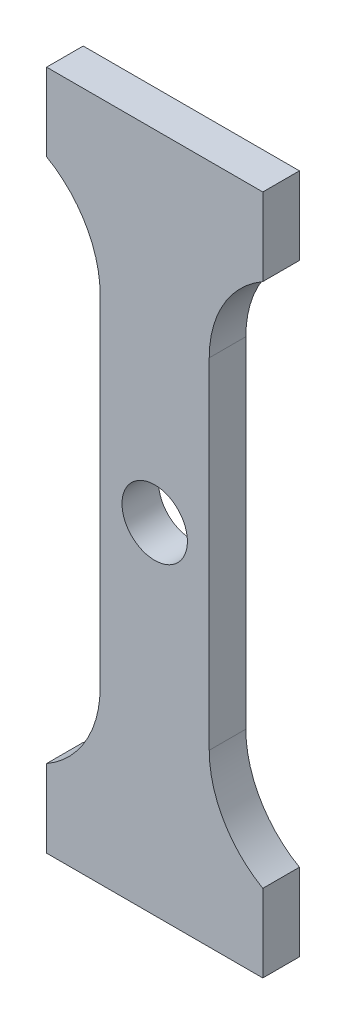
ISO-10303-21;
HEADER;
FILE_DESCRIPTION(('STEP AP214'),'2;1');
FILE_NAME('part.step','',(''),(''),'','','');
FILE_SCHEMA(('AUTOMOTIVE_DESIGN { 1 0 10303 214 1 1 1 1 }'));
ENDSEC;
DATA;
#1=APPLICATION_CONTEXT('core data for automotive mechanical design processes');
#2=APPLICATION_PROTOCOL_DEFINITION('international standard','automotive_design',2000,#1);
#3=PRODUCT_CONTEXT('',#1,'mechanical');
#4=PRODUCT('Part','Part','',(#3));
#5=PRODUCT_RELATED_PRODUCT_CATEGORY('part','',(#4));
#6=PRODUCT_DEFINITION_FORMATION('','',#4);
#7=PRODUCT_DEFINITION_CONTEXT('part definition',#1,'design');
#8=PRODUCT_DEFINITION('design','',#6,#7);
#9=PRODUCT_DEFINITION_SHAPE('','',#8);
#10=(LENGTH_UNIT() NAMED_UNIT(*) SI_UNIT(.MILLI.,.METRE.));
#11=(NAMED_UNIT(*) PLANE_ANGLE_UNIT() SI_UNIT($,.RADIAN.));
#12=(NAMED_UNIT(*) SI_UNIT($,.STERADIAN.) SOLID_ANGLE_UNIT());
#13=UNCERTAINTY_MEASURE_WITH_UNIT(LENGTH_MEASURE(1.E-05),#10,'distance_accuracy_value','');
#14=(GEOMETRIC_REPRESENTATION_CONTEXT(3) GLOBAL_UNCERTAINTY_ASSIGNED_CONTEXT((#13)) GLOBAL_UNIT_ASSIGNED_CONTEXT((#10,
#11,#12)) REPRESENTATION_CONTEXT('',''));
#15=CARTESIAN_POINT('',(0.,0.,0.));
#16=DIRECTION('',(0.,0.,1.));
#17=DIRECTION('',(1.,0.,0.));
#18=AXIS2_PLACEMENT_3D('',#15,#16,#17);
#19=CARTESIAN_POINT('',(-44.1666236676775,46.4188626587832,10.));
#20=DIRECTION('',(0.,0.,1.));
#21=DIRECTION('',(1.,0.,0.));
#22=AXIS2_PLACEMENT_3D('',#19,#20,#21);
#23=PLANE('',#22);
#24=DIRECTION('',(0.,-1.,0.));
#25=VECTOR('',#24,1.);
#26=CARTESIAN_POINT('',(-29.5271848431229,92.9707306546977,10.));
#27=LINE('',#26,#25);
#28=CARTESIAN_POINT('',(-29.5271848431229,92.9707306546977,10.));
#29=VERTEX_POINT('',#28);
#30=CARTESIAN_POINT('',(-29.5271848431229,71.764892872897,10.));
#31=VERTEX_POINT('',#30);
#32=EDGE_CURVE('E183',#29,#31,#27,.T.);
#33=ORIENTED_EDGE('',*,*,#32,.T.);
#34=CARTESIAN_POINT('',(-44.1666236676775,46.4188626587832,10.));
#35=DIRECTION('',(0.,0.,-1.));
#36=DIRECTION('',(1.,0.,0.));
#37=AXIS2_PLACEMENT_3D('',#34,#35,#36);
#38=CIRCLE('',#37,29.2700259089849);
#39=CARTESIAN_POINT('',(-14.8965977586926,46.4188626587833,10.));
#40=VERTEX_POINT('',#39);
#41=EDGE_CURVE('E111',#31,#40,#38,.T.);
#42=ORIENTED_EDGE('',*,*,#41,.T.);
#43=DIRECTION('',(0.,-1.,0.));
#44=VECTOR('',#43,1.);
#45=CARTESIAN_POINT('',(-14.8965977586926,46.4188626587833,10.));
#46=LINE('',#45,#44);
#47=CARTESIAN_POINT('',(-14.8965977586926,-46.4188626587832,10.));
#48=VERTEX_POINT('',#47);
#49=EDGE_CURVE('E210',#40,#48,#46,.T.);
#50=ORIENTED_EDGE('',*,*,#49,.T.);
#51=CARTESIAN_POINT('',(-44.1666236676775,-46.4188626587832,10.));
#52=DIRECTION('',(0.,0.,-1.));
#53=DIRECTION('',(-1.,0.,0.));
#54=AXIS2_PLACEMENT_3D('',#51,#52,#53);
#55=CIRCLE('',#54,29.2700259089849);
#56=CARTESIAN_POINT('',(-29.5271848431229,-71.764892872897,10.));
#57=VERTEX_POINT('',#56);
#58=EDGE_CURVE('E229',#48,#57,#55,.T.);
#59=ORIENTED_EDGE('',*,*,#58,.T.);
#60=DIRECTION('',(0.,-1.,0.));
#61=VECTOR('',#60,1.);
#62=CARTESIAN_POINT('',(-29.5271848431229,-92.9707306546977,10.));
#63=LINE('',#62,#61);
#64=CARTESIAN_POINT('',(-29.5271848431229,-92.9707306546977,10.));
#65=VERTEX_POINT('',#64);
#66=EDGE_CURVE('E226',#57,#65,#63,.T.);
#67=ORIENTED_EDGE('',*,*,#66,.T.);
#68=DIRECTION('',(1.,0.,0.));
#69=VECTOR('',#68,1.);
#70=CARTESIAN_POINT('',(29.5271848431229,-92.9707306546977,10.));
#71=LINE('',#70,#69);
#72=CARTESIAN_POINT('',(29.5271848431229,-92.9707306546977,10.));
#73=VERTEX_POINT('',#72);
#74=EDGE_CURVE('E228',#65,#73,#71,.T.);
#75=ORIENTED_EDGE('',*,*,#74,.T.);
#76=DIRECTION('',(0.,1.,0.));
#77=VECTOR('',#76,1.);
#78=CARTESIAN_POINT('',(29.5271848431229,-92.9707306546977,10.));
#79=LINE('',#78,#77);
#80=CARTESIAN_POINT('',(29.5271848431229,-71.764892872897,10.));
#81=VERTEX_POINT('',#80);
#82=EDGE_CURVE('E231',#73,#81,#79,.T.);
#83=ORIENTED_EDGE('',*,*,#82,.T.);
#84=CARTESIAN_POINT('',(44.1666236676775,-46.4188626587832,10.));
#85=DIRECTION('',(0.,0.,-1.));
#86=DIRECTION('',(1.,0.,0.));
#87=AXIS2_PLACEMENT_3D('',#84,#85,#86);
#88=CIRCLE('',#87,29.2700259089849);
#89=CARTESIAN_POINT('',(14.8965977586926,-46.4188626587833,10.));
#90=VERTEX_POINT('',#89);
#91=EDGE_CURVE('E237',#81,#90,#88,.T.);
#92=ORIENTED_EDGE('',*,*,#91,.T.);
#93=DIRECTION('',(0.,1.,0.));
#94=VECTOR('',#93,1.);
#95=CARTESIAN_POINT('',(14.8965977586926,46.4188626587833,10.));
#96=LINE('',#95,#94);
#97=CARTESIAN_POINT('',(14.8965977586926,46.4188626587833,10.));
#98=VERTEX_POINT('',#97);
#99=EDGE_CURVE('E142',#90,#98,#96,.T.);
#100=ORIENTED_EDGE('',*,*,#99,.T.);
#101=CARTESIAN_POINT('',(44.1666236676775,46.4188626587832,10.));
#102=DIRECTION('',(0.,0.,-1.));
#103=DIRECTION('',(-1.,0.,0.));
#104=AXIS2_PLACEMENT_3D('',#101,#102,#103);
#105=CIRCLE('',#104,29.2700259089849);
#106=CARTESIAN_POINT('',(29.5271848431229,71.764892872897,10.));
#107=VERTEX_POINT('',#106);
#108=EDGE_CURVE('E136',#98,#107,#105,.T.);
#109=ORIENTED_EDGE('',*,*,#108,.T.);
#110=DIRECTION('',(0.,1.,0.));
#111=VECTOR('',#110,1.);
#112=CARTESIAN_POINT('',(29.5271848431229,92.9707306546977,10.));
#113=LINE('',#112,#111);
#114=CARTESIAN_POINT('',(29.5271848431229,92.9707306546977,10.));
#115=VERTEX_POINT('',#114);
#116=EDGE_CURVE('E140',#107,#115,#113,.T.);
#117=ORIENTED_EDGE('',*,*,#116,.T.);
#118=DIRECTION('',(-1.,0.,0.));
#119=VECTOR('',#118,1.);
#120=CARTESIAN_POINT('',(29.5271848431229,92.9707306546977,10.));
#121=LINE('',#120,#119);
#122=EDGE_CURVE('E56',#115,#29,#121,.T.);
#123=ORIENTED_EDGE('',*,*,#122,.T.);
#124=EDGE_LOOP('',(#33,#42,#50,#59,#67,#75,#83,#92,#100,#109,#117,#123));
#125=FACE_BOUND('',#124,.T.);
#126=CARTESIAN_POINT('',(0.,0.,10.));
#127=DIRECTION('',(0.,0.,1.));
#128=DIRECTION('',(1.,0.,0.));
#129=AXIS2_PLACEMENT_3D('',#126,#127,#128);
#130=CIRCLE('',#129,8.93910654423591);
#131=CARTESIAN_POINT('',(8.93910654423591,0.,10.));
#132=VERTEX_POINT('',#131);
#133=EDGE_CURVE('E164',#132,#132,#130,.T.);
#134=ORIENTED_EDGE('',*,*,#133,.F.);
#135=EDGE_LOOP('',(#134));
#136=FACE_BOUND('',#135,.T.);
#137=ADVANCED_FACE('F39',(#125,#136),#23,.T.);
#138=CARTESIAN_POINT('',(-44.1666236676775,46.4188626587832,0.));
#139=DIRECTION('',(0.,0.,1.));
#140=DIRECTION('',(1.,0.,0.));
#141=AXIS2_PLACEMENT_3D('',#138,#139,#140);
#142=PLANE('',#141);
#143=DIRECTION('',(0.,-1.,0.));
#144=VECTOR('',#143,1.);
#145=CARTESIAN_POINT('',(-29.5271848431229,92.9707306546977,0.));
#146=LINE('',#145,#144);
#147=CARTESIAN_POINT('',(-29.5271848431229,92.9707306546977,0.));
#148=VERTEX_POINT('',#147);
#149=CARTESIAN_POINT('',(-29.5271848431229,71.764892872897,0.));
#150=VERTEX_POINT('',#149);
#151=EDGE_CURVE('E160',#148,#150,#146,.T.);
#152=ORIENTED_EDGE('',*,*,#151,.F.);
#153=DIRECTION('',(-1.,0.,0.));
#154=VECTOR('',#153,1.);
#155=CARTESIAN_POINT('',(29.5271848431229,92.9707306546977,0.));
#156=LINE('',#155,#154);
#157=CARTESIAN_POINT('',(29.5271848431229,92.9707306546977,0.));
#158=VERTEX_POINT('',#157);
#159=EDGE_CURVE('E103',#158,#148,#156,.T.);
#160=ORIENTED_EDGE('',*,*,#159,.F.);
#161=DIRECTION('',(0.,1.,0.));
#162=VECTOR('',#161,1.);
#163=CARTESIAN_POINT('',(29.5271848431229,92.9707306546977,0.));
#164=LINE('',#163,#162);
#165=CARTESIAN_POINT('',(29.5271848431229,71.764892872897,0.));
#166=VERTEX_POINT('',#165);
#167=EDGE_CURVE('E97',#166,#158,#164,.T.);
#168=ORIENTED_EDGE('',*,*,#167,.F.);
#169=CARTESIAN_POINT('',(44.1666236676775,46.4188626587832,0.));
#170=DIRECTION('',(0.,0.,-1.));
#171=DIRECTION('',(-1.,0.,0.));
#172=AXIS2_PLACEMENT_3D('',#169,#170,#171);
#173=CIRCLE('',#172,29.2700259089849);
#174=CARTESIAN_POINT('',(14.8965977586926,46.4188626587833,0.));
#175=VERTEX_POINT('',#174);
#176=EDGE_CURVE('E150',#175,#166,#173,.T.);
#177=ORIENTED_EDGE('',*,*,#176,.F.);
#178=DIRECTION('',(0.,1.,0.));
#179=VECTOR('',#178,1.);
#180=CARTESIAN_POINT('',(14.8965977586926,46.4188626587833,0.));
#181=LINE('',#180,#179);
#182=CARTESIAN_POINT('',(14.8965977586926,-46.4188626587833,0.));
#183=VERTEX_POINT('',#182);
#184=EDGE_CURVE('E178',#183,#175,#181,.T.);
#185=ORIENTED_EDGE('',*,*,#184,.F.);
#186=CARTESIAN_POINT('',(44.1666236676775,-46.4188626587832,0.));
#187=DIRECTION('',(0.,0.,-1.));
#188=DIRECTION('',(1.,0.,0.));
#189=AXIS2_PLACEMENT_3D('',#186,#187,#188);
#190=CIRCLE('',#189,29.2700259089849);
#191=CARTESIAN_POINT('',(29.5271848431229,-71.764892872897,0.));
#192=VERTEX_POINT('',#191);
#193=EDGE_CURVE('E176',#192,#183,#190,.T.);
#194=ORIENTED_EDGE('',*,*,#193,.F.);
#195=DIRECTION('',(0.,1.,0.));
#196=VECTOR('',#195,1.);
#197=CARTESIAN_POINT('',(29.5271848431229,-92.9707306546977,0.));
#198=LINE('',#197,#196);
#199=CARTESIAN_POINT('',(29.5271848431229,-92.9707306546977,0.));
#200=VERTEX_POINT('',#199);
#201=EDGE_CURVE('E174',#200,#192,#198,.T.);
#202=ORIENTED_EDGE('',*,*,#201,.F.);
#203=DIRECTION('',(1.,0.,0.));
#204=VECTOR('',#203,1.);
#205=CARTESIAN_POINT('',(29.5271848431229,-92.9707306546977,0.));
#206=LINE('',#205,#204);
#207=CARTESIAN_POINT('',(-29.5271848431229,-92.9707306546977,0.));
#208=VERTEX_POINT('',#207);
#209=EDGE_CURVE('E172',#208,#200,#206,.T.);
#210=ORIENTED_EDGE('',*,*,#209,.F.);
#211=DIRECTION('',(0.,-1.,0.));
#212=VECTOR('',#211,1.);
#213=CARTESIAN_POINT('',(-29.5271848431229,-92.9707306546977,0.));
#214=LINE('',#213,#212);
#215=CARTESIAN_POINT('',(-29.5271848431229,-71.764892872897,0.));
#216=VERTEX_POINT('',#215);
#217=EDGE_CURVE('E170',#216,#208,#214,.T.);
#218=ORIENTED_EDGE('',*,*,#217,.F.);
#219=CARTESIAN_POINT('',(-44.1666236676775,-46.4188626587832,0.));
#220=DIRECTION('',(0.,0.,-1.));
#221=DIRECTION('',(-1.,0.,0.));
#222=AXIS2_PLACEMENT_3D('',#219,#220,#221);
#223=CIRCLE('',#222,29.2700259089849);
#224=CARTESIAN_POINT('',(-14.8965977586926,-46.4188626587832,0.));
#225=VERTEX_POINT('',#224);
#226=EDGE_CURVE('E168',#225,#216,#223,.T.);
#227=ORIENTED_EDGE('',*,*,#226,.F.);
#228=DIRECTION('',(0.,-1.,0.));
#229=VECTOR('',#228,1.);
#230=CARTESIAN_POINT('',(-14.8965977586926,46.4188626587833,0.));
#231=LINE('',#230,#229);
#232=CARTESIAN_POINT('',(-14.8965977586926,46.4188626587833,0.));
#233=VERTEX_POINT('',#232);
#234=EDGE_CURVE('E166',#233,#225,#231,.T.);
#235=ORIENTED_EDGE('',*,*,#234,.F.);
#236=CARTESIAN_POINT('',(-44.1666236676775,46.4188626587832,0.));
#237=DIRECTION('',(0.,0.,-1.));
#238=DIRECTION('',(1.,0.,0.));
#239=AXIS2_PLACEMENT_3D('',#236,#237,#238);
#240=CIRCLE('',#239,29.2700259089849);
#241=EDGE_CURVE('E163',#150,#233,#240,.T.);
#242=ORIENTED_EDGE('',*,*,#241,.F.);
#243=EDGE_LOOP('',(#152,#160,#168,#177,#185,#194,#202,#210,#218,#227,#235,#242));
#244=FACE_BOUND('',#243,.T.);
#245=CARTESIAN_POINT('',(0.,0.,0.));
#246=DIRECTION('',(0.,0.,1.));
#247=DIRECTION('',(1.,0.,0.));
#248=AXIS2_PLACEMENT_3D('',#245,#246,#247);
#249=CIRCLE('',#248,8.93910654423591);
#250=CARTESIAN_POINT('',(8.93910654423591,0.,0.));
#251=VERTEX_POINT('',#250);
#252=EDGE_CURVE('E388',#251,#251,#249,.T.);
#253=ORIENTED_EDGE('',*,*,#252,.T.);
#254=EDGE_LOOP('',(#253));
#255=FACE_BOUND('',#254,.T.);
#256=ADVANCED_FACE('F214',(#244,#255),#142,.F.);
#257=CARTESIAN_POINT('',(-29.5271848431229,92.9707306546977,10.));
#258=DIRECTION('',(1.,0.,0.));
#259=DIRECTION('',(0.,0.,-1.));
#260=AXIS2_PLACEMENT_3D('',#257,#258,#259);
#261=PLANE('',#260);
#262=ORIENTED_EDGE('',*,*,#151,.T.);
#263=DIRECTION('',(0.,0.,-1.));
#264=VECTOR('',#263,1.);
#265=CARTESIAN_POINT('',(-29.5271848431229,71.764892872897,10.));
#266=LINE('',#265,#264);
#267=EDGE_CURVE('E11',#31,#150,#266,.T.);
#268=ORIENTED_EDGE('',*,*,#267,.F.);
#269=ORIENTED_EDGE('',*,*,#32,.F.);
#270=DIRECTION('',(0.,0.,-1.));
#271=VECTOR('',#270,1.);
#272=CARTESIAN_POINT('',(-29.5271848431229,92.9707306546977,10.));
#273=LINE('',#272,#271);
#274=EDGE_CURVE('E156',#29,#148,#273,.T.);
#275=ORIENTED_EDGE('',*,*,#274,.T.);
#276=EDGE_LOOP('',(#262,#268,#269,#275));
#277=FACE_BOUND('',#276,.T.);
#278=ADVANCED_FACE('F41',(#277),#261,.F.);
#279=CARTESIAN_POINT('',(-44.1666236676775,46.4188626587832,10.));
#280=DIRECTION('',(0.,0.,-1.));
#281=DIRECTION('',(-1.,0.,0.));
#282=AXIS2_PLACEMENT_3D('',#279,#280,#281);
#283=CYLINDRICAL_SURFACE('',#282,29.2700259089849);
#284=ORIENTED_EDGE('',*,*,#241,.T.);
#285=DIRECTION('',(0.,0.,-1.));
#286=VECTOR('',#285,1.);
#287=CARTESIAN_POINT('',(-14.8965977586926,46.4188626587833,10.));
#288=LINE('',#287,#286);
#289=EDGE_CURVE('E48',#40,#233,#288,.T.);
#290=ORIENTED_EDGE('',*,*,#289,.F.);
#291=ORIENTED_EDGE('',*,*,#41,.F.);
#292=ORIENTED_EDGE('',*,*,#267,.T.);
#293=EDGE_LOOP('',(#284,#290,#291,#292));
#294=FACE_BOUND('',#293,.T.);
#295=ADVANCED_FACE('F271',(#294),#283,.F.);
#296=CARTESIAN_POINT('',(-14.8965977586926,46.4188626587833,10.));
#297=DIRECTION('',(1.,0.,0.));
#298=DIRECTION('',(0.,0.,-1.));
#299=AXIS2_PLACEMENT_3D('',#296,#297,#298);
#300=PLANE('',#299);
#301=ORIENTED_EDGE('',*,*,#234,.T.);
#302=DIRECTION('',(0.,0.,-1.));
#303=VECTOR('',#302,1.);
#304=CARTESIAN_POINT('',(-14.8965977586926,-46.4188626587832,10.));
#305=LINE('',#304,#303);
#306=EDGE_CURVE('E202',#48,#225,#305,.T.);
#307=ORIENTED_EDGE('',*,*,#306,.F.);
#308=ORIENTED_EDGE('',*,*,#49,.F.);
#309=ORIENTED_EDGE('',*,*,#289,.T.);
#310=EDGE_LOOP('',(#301,#307,#308,#309));
#311=FACE_BOUND('',#310,.T.);
#312=ADVANCED_FACE('F208',(#311),#300,.F.);
#313=CARTESIAN_POINT('',(-44.1666236676775,-46.4188626587832,10.));
#314=DIRECTION('',(0.,0.,-1.));
#315=DIRECTION('',(-1.,0.,0.));
#316=AXIS2_PLACEMENT_3D('',#313,#314,#315);
#317=CYLINDRICAL_SURFACE('',#316,29.2700259089849);
#318=ORIENTED_EDGE('',*,*,#226,.T.);
#319=DIRECTION('',(0.,0.,-1.));
#320=VECTOR('',#319,1.);
#321=CARTESIAN_POINT('',(-29.5271848431229,-71.764892872897,10.));
#322=LINE('',#321,#320);
#323=EDGE_CURVE('E199',#57,#216,#322,.T.);
#324=ORIENTED_EDGE('',*,*,#323,.F.);
#325=ORIENTED_EDGE('',*,*,#58,.F.);
#326=ORIENTED_EDGE('',*,*,#306,.T.);
#327=EDGE_LOOP('',(#318,#324,#325,#326));
#328=FACE_BOUND('',#327,.T.);
#329=ADVANCED_FACE('F220',(#328),#317,.F.);
#330=CARTESIAN_POINT('',(-29.5271848431229,-92.9707306546977,10.));
#331=DIRECTION('',(1.,0.,0.));
#332=DIRECTION('',(0.,0.,-1.));
#333=AXIS2_PLACEMENT_3D('',#330,#331,#332);
#334=PLANE('',#333);
#335=ORIENTED_EDGE('',*,*,#217,.T.);
#336=DIRECTION('',(0.,0.,-1.));
#337=VECTOR('',#336,1.);
#338=CARTESIAN_POINT('',(-29.5271848431229,-92.9707306546977,10.));
#339=LINE('',#338,#337);
#340=EDGE_CURVE('E196',#65,#208,#339,.T.);
#341=ORIENTED_EDGE('',*,*,#340,.F.);
#342=ORIENTED_EDGE('',*,*,#66,.F.);
#343=ORIENTED_EDGE('',*,*,#323,.T.);
#344=EDGE_LOOP('',(#335,#341,#342,#343));
#345=FACE_BOUND('',#344,.T.);
#346=ADVANCED_FACE('F224',(#345),#334,.F.);
#347=CARTESIAN_POINT('',(29.5271848431229,-92.9707306546977,10.));
#348=DIRECTION('',(0.,1.,0.));
#349=DIRECTION('',(0.,0.,1.));
#350=AXIS2_PLACEMENT_3D('',#347,#348,#349);
#351=PLANE('',#350);
#352=ORIENTED_EDGE('',*,*,#209,.T.);
#353=DIRECTION('',(0.,0.,-1.));
#354=VECTOR('',#353,1.);
#355=CARTESIAN_POINT('',(29.5271848431229,-92.9707306546977,10.));
#356=LINE('',#355,#354);
#357=EDGE_CURVE('E193',#73,#200,#356,.T.);
#358=ORIENTED_EDGE('',*,*,#357,.F.);
#359=ORIENTED_EDGE('',*,*,#74,.F.);
#360=ORIENTED_EDGE('',*,*,#340,.T.);
#361=EDGE_LOOP('',(#352,#358,#359,#360));
#362=FACE_BOUND('',#361,.T.);
#363=ADVANCED_FACE('F284',(#362),#351,.F.);
#364=CARTESIAN_POINT('',(29.5271848431229,-92.9707306546977,10.));
#365=DIRECTION('',(-1.,0.,0.));
#366=DIRECTION('',(0.,0.,1.));
#367=AXIS2_PLACEMENT_3D('',#364,#365,#366);
#368=PLANE('',#367);
#369=ORIENTED_EDGE('',*,*,#201,.T.);
#370=DIRECTION('',(0.,0.,-1.));
#371=VECTOR('',#370,1.);
#372=CARTESIAN_POINT('',(29.5271848431229,-71.764892872897,10.));
#373=LINE('',#372,#371);
#374=EDGE_CURVE('E190',#81,#192,#373,.T.);
#375=ORIENTED_EDGE('',*,*,#374,.F.);
#376=ORIENTED_EDGE('',*,*,#82,.F.);
#377=ORIENTED_EDGE('',*,*,#357,.T.);
#378=EDGE_LOOP('',(#369,#375,#376,#377));
#379=FACE_BOUND('',#378,.T.);
#380=ADVANCED_FACE('F287',(#379),#368,.F.);
#381=CARTESIAN_POINT('',(44.1666236676775,-46.4188626587832,10.));
#382=DIRECTION('',(0.,0.,-1.));
#383=DIRECTION('',(-1.,0.,0.));
#384=AXIS2_PLACEMENT_3D('',#381,#382,#383);
#385=CYLINDRICAL_SURFACE('',#384,29.2700259089849);
#386=ORIENTED_EDGE('',*,*,#193,.T.);
#387=DIRECTION('',(0.,0.,-1.));
#388=VECTOR('',#387,1.);
#389=CARTESIAN_POINT('',(14.8965977586926,-46.4188626587833,10.));
#390=LINE('',#389,#388);
#391=EDGE_CURVE('E187',#90,#183,#390,.T.);
#392=ORIENTED_EDGE('',*,*,#391,.F.);
#393=ORIENTED_EDGE('',*,*,#91,.F.);
#394=ORIENTED_EDGE('',*,*,#374,.T.);
#395=EDGE_LOOP('',(#386,#392,#393,#394));
#396=FACE_BOUND('',#395,.T.);
#397=ADVANCED_FACE('F243',(#396),#385,.F.);
#398=CARTESIAN_POINT('',(14.8965977586926,46.4188626587833,10.));
#399=DIRECTION('',(-1.,0.,0.));
#400=DIRECTION('',(0.,0.,1.));
#401=AXIS2_PLACEMENT_3D('',#398,#399,#400);
#402=PLANE('',#401);
#403=ORIENTED_EDGE('',*,*,#184,.T.);
#404=DIRECTION('',(0.,0.,-1.));
#405=VECTOR('',#404,1.);
#406=CARTESIAN_POINT('',(14.8965977586926,46.4188626587833,10.));
#407=LINE('',#406,#405);
#408=EDGE_CURVE('E151',#98,#175,#407,.T.);
#409=ORIENTED_EDGE('',*,*,#408,.F.);
#410=ORIENTED_EDGE('',*,*,#99,.F.);
#411=ORIENTED_EDGE('',*,*,#391,.T.);
#412=EDGE_LOOP('',(#403,#409,#410,#411));
#413=FACE_BOUND('',#412,.T.);
#414=ADVANCED_FACE('F247',(#413),#402,.F.);
#415=CARTESIAN_POINT('',(44.1666236676775,46.4188626587832,10.));
#416=DIRECTION('',(0.,0.,-1.));
#417=DIRECTION('',(-1.,0.,0.));
#418=AXIS2_PLACEMENT_3D('',#415,#416,#417);
#419=CYLINDRICAL_SURFACE('',#418,29.2700259089849);
#420=ORIENTED_EDGE('',*,*,#176,.T.);
#421=DIRECTION('',(0.,0.,-1.));
#422=VECTOR('',#421,1.);
#423=CARTESIAN_POINT('',(29.5271848431229,71.764892872897,10.));
#424=LINE('',#423,#422);
#425=EDGE_CURVE('E147',#107,#166,#424,.T.);
#426=ORIENTED_EDGE('',*,*,#425,.F.);
#427=ORIENTED_EDGE('',*,*,#108,.F.);
#428=ORIENTED_EDGE('',*,*,#408,.T.);
#429=EDGE_LOOP('',(#420,#426,#427,#428));
#430=FACE_BOUND('',#429,.T.);
#431=ADVANCED_FACE('F148',(#430),#419,.F.);
#432=CARTESIAN_POINT('',(29.5271848431229,92.9707306546977,10.));
#433=DIRECTION('',(-1.,0.,0.));
#434=DIRECTION('',(0.,0.,1.));
#435=AXIS2_PLACEMENT_3D('',#432,#433,#434);
#436=PLANE('',#435);
#437=ORIENTED_EDGE('',*,*,#167,.T.);
#438=DIRECTION('',(0.,0.,-1.));
#439=VECTOR('',#438,1.);
#440=CARTESIAN_POINT('',(29.5271848431229,92.9707306546977,10.));
#441=LINE('',#440,#439);
#442=EDGE_CURVE('E152',#115,#158,#441,.T.);
#443=ORIENTED_EDGE('',*,*,#442,.F.);
#444=ORIENTED_EDGE('',*,*,#116,.F.);
#445=ORIENTED_EDGE('',*,*,#425,.T.);
#446=EDGE_LOOP('',(#437,#443,#444,#445));
#447=FACE_BOUND('',#446,.T.);
#448=ADVANCED_FACE('F154',(#447),#436,.F.);
#449=CARTESIAN_POINT('',(29.5271848431229,92.9707306546977,10.));
#450=DIRECTION('',(0.,-1.,0.));
#451=DIRECTION('',(0.,0.,-1.));
#452=AXIS2_PLACEMENT_3D('',#449,#450,#451);
#453=PLANE('',#452);
#454=ORIENTED_EDGE('',*,*,#159,.T.);
#455=ORIENTED_EDGE('',*,*,#274,.F.);
#456=ORIENTED_EDGE('',*,*,#122,.F.);
#457=ORIENTED_EDGE('',*,*,#442,.T.);
#458=EDGE_LOOP('',(#454,#455,#456,#457));
#459=FACE_BOUND('',#458,.T.);
#460=ADVANCED_FACE('F251',(#459),#453,.F.);
#461=CARTESIAN_POINT('',(0.,0.,10.));
#462=DIRECTION('',(0.,0.,-1.));
#463=DIRECTION('',(-1.,0.,0.));
#464=AXIS2_PLACEMENT_3D('',#461,#462,#463);
#465=CYLINDRICAL_SURFACE('',#464,8.93910654423591);
#466=ORIENTED_EDGE('',*,*,#133,.T.);
#467=EDGE_LOOP('',(#466));
#468=FACE_BOUND('',#467,.T.);
#469=ORIENTED_EDGE('',*,*,#252,.F.);
#470=EDGE_LOOP('',(#469));
#471=FACE_BOUND('',#470,.T.);
#472=ADVANCED_FACE('F253',(#468,#471),#465,.F.);
#473=CLOSED_SHELL('',(#137,#256,#278,#295,#312,#329,#346,#363,#380,#397,#414,#431,#448,#460,#472));
#474=MANIFOLD_SOLID_BREP('B2',#473);
#475=ADVANCED_BREP_SHAPE_REPRESENTATION('',(#18,#474),#14);
#476=SHAPE_DEFINITION_REPRESENTATION(#9,#475);
ENDSEC;
END-ISO-10303-21;
